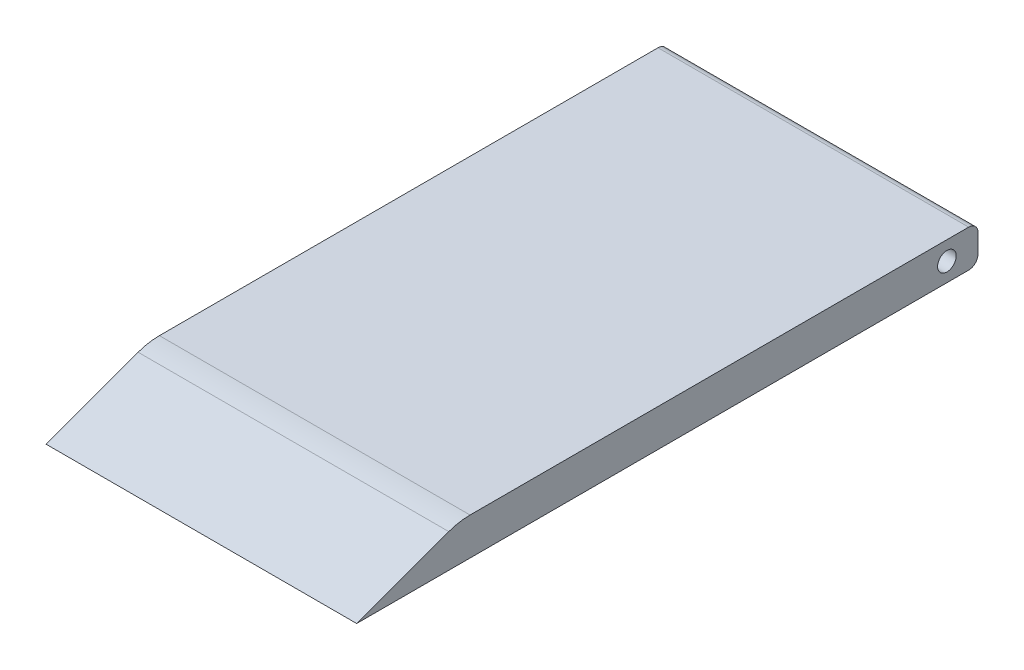
ISO-10303-21;
HEADER;
FILE_DESCRIPTION(('STEP AP214'),'2;1');
FILE_NAME('part.step','',(''),(''),'','','');
FILE_SCHEMA(('AUTOMOTIVE_DESIGN { 1 0 10303 214 1 1 1 1 }'));
ENDSEC;
DATA;
#1=APPLICATION_CONTEXT('core data for automotive mechanical design processes');
#2=APPLICATION_PROTOCOL_DEFINITION('international standard','automotive_design',2000,#1);
#3=PRODUCT_CONTEXT('',#1,'mechanical');
#4=PRODUCT('Part','Part','',(#3));
#5=PRODUCT_RELATED_PRODUCT_CATEGORY('part','',(#4));
#6=PRODUCT_DEFINITION_FORMATION('','',#4);
#7=PRODUCT_DEFINITION_CONTEXT('part definition',#1,'design');
#8=PRODUCT_DEFINITION('design','',#6,#7);
#9=PRODUCT_DEFINITION_SHAPE('','',#8);
#10=(LENGTH_UNIT() NAMED_UNIT(*) SI_UNIT(.MILLI.,.METRE.));
#11=(NAMED_UNIT(*) PLANE_ANGLE_UNIT() SI_UNIT($,.RADIAN.));
#12=(NAMED_UNIT(*) SI_UNIT($,.STERADIAN.) SOLID_ANGLE_UNIT());
#13=UNCERTAINTY_MEASURE_WITH_UNIT(LENGTH_MEASURE(1.E-05),#10,'distance_accuracy_value','');
#14=(GEOMETRIC_REPRESENTATION_CONTEXT(3) GLOBAL_UNCERTAINTY_ASSIGNED_CONTEXT((#13)) GLOBAL_UNIT_ASSIGNED_CONTEXT((#10,
#11,#12)) REPRESENTATION_CONTEXT('',''));
#15=CARTESIAN_POINT('',(0.,0.,0.));
#16=DIRECTION('',(0.,0.,1.));
#17=DIRECTION('',(1.,0.,0.));
#18=AXIS2_PLACEMENT_3D('',#15,#16,#17);
#19=CARTESIAN_POINT('',(0.,6.,0.));
#20=DIRECTION('',(1.,0.,0.));
#21=DIRECTION('',(0.,0.,-1.));
#22=AXIS2_PLACEMENT_3D('',#19,#20,#21);
#23=PLANE('',#22);
#24=CARTESIAN_POINT('',(0.,3.,5.));
#25=DIRECTION('',(1.,0.,0.));
#26=DIRECTION('',(0.,0.,-1.));
#27=AXIS2_PLACEMENT_3D('',#24,#25,#26);
#28=CIRCLE('',#27,1.5);
#29=CARTESIAN_POINT('',(0.,3.,3.5));
#30=VERTEX_POINT('',#29);
#31=EDGE_CURVE('E102',#30,#30,#28,.T.);
#32=ORIENTED_EDGE('',*,*,#31,.T.);
#33=EDGE_LOOP('',(#32));
#34=FACE_BOUND('',#33,.T.);
#35=DIRECTION('',(0.,0.34202014332567,-0.939692620785908));
#36=VECTOR('',#35,1.);
#37=CARTESIAN_POINT('',(0.,6.,83.5151354832723));
#38=LINE('',#37,#36);
#39=CARTESIAN_POINT('',(0.,0.,100.));
#40=VERTEX_POINT('',#39);
#41=CARTESIAN_POINT('',(0.,5.39692620785908,85.1720671094444));
#42=VERTEX_POINT('',#41);
#43=EDGE_CURVE('E95',#40,#42,#38,.T.);
#44=ORIENTED_EDGE('',*,*,#43,.T.);
#45=CARTESIAN_POINT('',(0.,-4.,81.7518656761877));
#46=DIRECTION('',(1.,0.,0.));
#47=DIRECTION('',(0.,0.,-1.));
#48=AXIS2_PLACEMENT_3D('',#45,#46,#47);
#49=CIRCLE('',#48,10.);
#50=CARTESIAN_POINT('',(0.,6.,81.7518656761877));
#51=VERTEX_POINT('',#50);
#52=EDGE_CURVE('E11',#42,#51,#49,.F.);
#53=ORIENTED_EDGE('',*,*,#52,.T.);
#54=DIRECTION('',(0.,0.,1.));
#55=VECTOR('',#54,1.);
#56=CARTESIAN_POINT('',(0.,6.,0.));
#57=LINE('',#56,#55);
#58=CARTESIAN_POINT('',(0.,6.,1.5));
#59=VERTEX_POINT('',#58);
#60=EDGE_CURVE('E143',#59,#51,#57,.T.);
#61=ORIENTED_EDGE('',*,*,#60,.F.);
#62=CARTESIAN_POINT('',(0.,4.5,1.5));
#63=DIRECTION('',(1.,0.,0.));
#64=DIRECTION('',(0.,0.,-1.));
#65=AXIS2_PLACEMENT_3D('',#62,#63,#64);
#66=CIRCLE('',#65,1.5);
#67=CARTESIAN_POINT('',(0.,4.5,0.));
#68=VERTEX_POINT('',#67);
#69=EDGE_CURVE('E130',#59,#68,#66,.F.);
#70=ORIENTED_EDGE('',*,*,#69,.T.);
#71=DIRECTION('',(0.,-1.,0.));
#72=VECTOR('',#71,1.);
#73=CARTESIAN_POINT('',(0.,6.,0.));
#74=LINE('',#73,#72);
#75=CARTESIAN_POINT('',(0.,1.5,0.));
#76=VERTEX_POINT('',#75);
#77=EDGE_CURVE('E140',#68,#76,#74,.T.);
#78=ORIENTED_EDGE('',*,*,#77,.T.);
#79=CARTESIAN_POINT('',(0.,1.5,1.5));
#80=DIRECTION('',(1.,0.,0.));
#81=DIRECTION('',(0.,0.,-1.));
#82=AXIS2_PLACEMENT_3D('',#79,#80,#81);
#83=CIRCLE('',#82,1.5);
#84=CARTESIAN_POINT('',(0.,0.,1.5));
#85=VERTEX_POINT('',#84);
#86=EDGE_CURVE('E98',#76,#85,#83,.F.);
#87=ORIENTED_EDGE('',*,*,#86,.T.);
#88=DIRECTION('',(0.,0.,1.));
#89=VECTOR('',#88,1.);
#90=CARTESIAN_POINT('',(0.,0.,0.));
#91=LINE('',#90,#89);
#92=EDGE_CURVE('E93',#85,#40,#91,.T.);
#93=ORIENTED_EDGE('',*,*,#92,.T.);
#94=EDGE_LOOP('',(#44,#53,#61,#70,#78,#87,#93));
#95=FACE_BOUND('',#94,.T.);
#96=ADVANCED_FACE('F36',(#34,#95),#23,.F.);
#97=CARTESIAN_POINT('',(50.,6.,100.));
#98=DIRECTION('',(-1.,0.,0.));
#99=DIRECTION('',(0.,0.,1.));
#100=AXIS2_PLACEMENT_3D('',#97,#98,#99);
#101=PLANE('',#100);
#102=CARTESIAN_POINT('',(50.,3.,5.));
#103=DIRECTION('',(1.,0.,0.));
#104=DIRECTION('',(0.,0.,-1.));
#105=AXIS2_PLACEMENT_3D('',#102,#103,#104);
#106=CIRCLE('',#105,1.5);
#107=CARTESIAN_POINT('',(50.,3.,3.5));
#108=VERTEX_POINT('',#107);
#109=EDGE_CURVE('E148',#108,#108,#106,.T.);
#110=ORIENTED_EDGE('',*,*,#109,.F.);
#111=EDGE_LOOP('',(#110));
#112=FACE_BOUND('',#111,.T.);
#113=DIRECTION('',(0.,0.,-1.));
#114=VECTOR('',#113,1.);
#115=CARTESIAN_POINT('',(50.,6.,100.));
#116=LINE('',#115,#114);
#117=CARTESIAN_POINT('',(50.,6.,81.7518656761877));
#118=VERTEX_POINT('',#117);
#119=CARTESIAN_POINT('',(50.,6.,1.5));
#120=VERTEX_POINT('',#119);
#121=EDGE_CURVE('E142',#118,#120,#116,.T.);
#122=ORIENTED_EDGE('',*,*,#121,.F.);
#123=CARTESIAN_POINT('',(50.,-4.,81.7518656761877));
#124=DIRECTION('',(-1.,0.,0.));
#125=DIRECTION('',(0.,0.,1.));
#126=AXIS2_PLACEMENT_3D('',#123,#124,#125);
#127=CIRCLE('',#126,10.);
#128=CARTESIAN_POINT('',(50.,5.39692620785908,85.1720671094444));
#129=VERTEX_POINT('',#128);
#130=EDGE_CURVE('E58',#118,#129,#127,.F.);
#131=ORIENTED_EDGE('',*,*,#130,.T.);
#132=DIRECTION('',(0.,-0.34202014332567,0.939692620785908));
#133=VECTOR('',#132,1.);
#134=CARTESIAN_POINT('',(50.,6.,83.5151354832723));
#135=LINE('',#134,#133);
#136=CARTESIAN_POINT('',(50.,0.,100.));
#137=VERTEX_POINT('',#136);
#138=EDGE_CURVE('E112',#129,#137,#135,.T.);
#139=ORIENTED_EDGE('',*,*,#138,.T.);
#140=DIRECTION('',(0.,0.,-1.));
#141=VECTOR('',#140,1.);
#142=CARTESIAN_POINT('',(50.,0.,100.));
#143=LINE('',#142,#141);
#144=CARTESIAN_POINT('',(50.,0.,1.5));
#145=VERTEX_POINT('',#144);
#146=EDGE_CURVE('E108',#137,#145,#143,.T.);
#147=ORIENTED_EDGE('',*,*,#146,.T.);
#148=CARTESIAN_POINT('',(50.,1.5,1.5));
#149=DIRECTION('',(-1.,0.,0.));
#150=DIRECTION('',(0.,0.,1.));
#151=AXIS2_PLACEMENT_3D('',#148,#149,#150);
#152=CIRCLE('',#151,1.5);
#153=CARTESIAN_POINT('',(50.,1.5,0.));
#154=VERTEX_POINT('',#153);
#155=EDGE_CURVE('E122',#145,#154,#152,.F.);
#156=ORIENTED_EDGE('',*,*,#155,.T.);
#157=DIRECTION('',(0.,-1.,0.));
#158=VECTOR('',#157,1.);
#159=CARTESIAN_POINT('',(50.,6.,0.));
#160=LINE('',#159,#158);
#161=CARTESIAN_POINT('',(50.,4.5,0.));
#162=VERTEX_POINT('',#161);
#163=EDGE_CURVE('E137',#162,#154,#160,.T.);
#164=ORIENTED_EDGE('',*,*,#163,.F.);
#165=CARTESIAN_POINT('',(50.,4.5,1.5));
#166=DIRECTION('',(-1.,0.,0.));
#167=DIRECTION('',(0.,0.,1.));
#168=AXIS2_PLACEMENT_3D('',#165,#166,#167);
#169=CIRCLE('',#168,1.5);
#170=EDGE_CURVE('E124',#162,#120,#169,.F.);
#171=ORIENTED_EDGE('',*,*,#170,.T.);
#172=EDGE_LOOP('',(#122,#131,#139,#147,#156,#164,#171));
#173=FACE_BOUND('',#172,.T.);
#174=ADVANCED_FACE('F162',(#112,#173),#101,.F.);
#175=CARTESIAN_POINT('',(0.,6.,0.));
#176=DIRECTION('',(0.,0.,1.));
#177=DIRECTION('',(1.,0.,0.));
#178=AXIS2_PLACEMENT_3D('',#175,#176,#177);
#179=PLANE('',#178);
#180=ORIENTED_EDGE('',*,*,#163,.T.);
#181=DIRECTION('',(-1.,0.,0.));
#182=VECTOR('',#181,1.);
#183=CARTESIAN_POINT('',(0.,1.5,0.));
#184=LINE('',#183,#182);
#185=EDGE_CURVE('E132',#154,#76,#184,.T.);
#186=ORIENTED_EDGE('',*,*,#185,.T.);
#187=ORIENTED_EDGE('',*,*,#77,.F.);
#188=DIRECTION('',(-1.,0.,0.));
#189=VECTOR('',#188,1.);
#190=CARTESIAN_POINT('',(50.,4.5,0.));
#191=LINE('',#190,#189);
#192=EDGE_CURVE('E135',#68,#162,#191,.F.);
#193=ORIENTED_EDGE('',*,*,#192,.T.);
#194=EDGE_LOOP('',(#180,#186,#187,#193));
#195=FACE_BOUND('',#194,.T.);
#196=ADVANCED_FACE('F164',(#195),#179,.F.);
#197=CARTESIAN_POINT('',(0.,6.,0.));
#198=DIRECTION('',(0.,1.,0.));
#199=DIRECTION('',(0.,0.,1.));
#200=AXIS2_PLACEMENT_3D('',#197,#198,#199);
#201=PLANE('',#200);
#202=ORIENTED_EDGE('',*,*,#60,.T.);
#203=DIRECTION('',(1.,0.,0.));
#204=VECTOR('',#203,1.);
#205=CARTESIAN_POINT('',(0.,6.,81.7518656761877));
#206=LINE('',#205,#204);
#207=EDGE_CURVE('E111',#51,#118,#206,.T.);
#208=ORIENTED_EDGE('',*,*,#207,.T.);
#209=ORIENTED_EDGE('',*,*,#121,.T.);
#210=DIRECTION('',(-1.,0.,0.));
#211=VECTOR('',#210,1.);
#212=CARTESIAN_POINT('',(0.,6.,1.5));
#213=LINE('',#212,#211);
#214=EDGE_CURVE('E116',#120,#59,#213,.T.);
#215=ORIENTED_EDGE('',*,*,#214,.T.);
#216=EDGE_LOOP('',(#202,#208,#209,#215));
#217=FACE_BOUND('',#216,.T.);
#218=ADVANCED_FACE('F170',(#217),#201,.T.);
#219=CARTESIAN_POINT('',(0.,0.,0.));
#220=DIRECTION('',(0.,1.,0.));
#221=DIRECTION('',(0.,0.,1.));
#222=AXIS2_PLACEMENT_3D('',#219,#220,#221);
#223=PLANE('',#222);
#224=ORIENTED_EDGE('',*,*,#92,.F.);
#225=DIRECTION('',(-1.,0.,0.));
#226=VECTOR('',#225,1.);
#227=CARTESIAN_POINT('',(0.,0.,1.5));
#228=LINE('',#227,#226);
#229=EDGE_CURVE('E127',#85,#145,#228,.F.);
#230=ORIENTED_EDGE('',*,*,#229,.T.);
#231=ORIENTED_EDGE('',*,*,#146,.F.);
#232=DIRECTION('',(1.,0.,0.));
#233=VECTOR('',#232,1.);
#234=CARTESIAN_POINT('',(0.,0.,100.));
#235=LINE('',#234,#233);
#236=EDGE_CURVE('E101',#40,#137,#235,.T.);
#237=ORIENTED_EDGE('',*,*,#236,.F.);
#238=EDGE_LOOP('',(#224,#230,#231,#237));
#239=FACE_BOUND('',#238,.T.);
#240=ADVANCED_FACE('F106',(#239),#223,.F.);
#241=CARTESIAN_POINT('',(0.,3.,5.));
#242=DIRECTION('',(1.,0.,0.));
#243=DIRECTION('',(0.,0.,-1.));
#244=AXIS2_PLACEMENT_3D('',#241,#242,#243);
#245=CYLINDRICAL_SURFACE('',#244,1.5);
#246=ORIENTED_EDGE('',*,*,#31,.F.);
#247=EDGE_LOOP('',(#246));
#248=FACE_BOUND('',#247,.T.);
#249=ORIENTED_EDGE('',*,*,#109,.T.);
#250=EDGE_LOOP('',(#249));
#251=FACE_BOUND('',#250,.T.);
#252=ADVANCED_FACE('F155',(#248,#251),#245,.F.);
#253=CARTESIAN_POINT('',(0.,1.5,1.5));
#254=DIRECTION('',(-1.,0.,0.));
#255=DIRECTION('',(0.,0.,1.));
#256=AXIS2_PLACEMENT_3D('',#253,#254,#255);
#257=CYLINDRICAL_SURFACE('',#256,1.5);
#258=ORIENTED_EDGE('',*,*,#155,.F.);
#259=ORIENTED_EDGE('',*,*,#229,.F.);
#260=ORIENTED_EDGE('',*,*,#86,.F.);
#261=ORIENTED_EDGE('',*,*,#185,.F.);
#262=EDGE_LOOP('',(#258,#259,#260,#261));
#263=FACE_BOUND('',#262,.T.);
#264=ADVANCED_FACE('F158',(#263),#257,.T.);
#265=CARTESIAN_POINT('',(0.,4.5,1.5));
#266=DIRECTION('',(1.,0.,0.));
#267=DIRECTION('',(0.,0.,-1.));
#268=AXIS2_PLACEMENT_3D('',#265,#266,#267);
#269=CYLINDRICAL_SURFACE('',#268,1.5);
#270=ORIENTED_EDGE('',*,*,#170,.F.);
#271=ORIENTED_EDGE('',*,*,#192,.F.);
#272=ORIENTED_EDGE('',*,*,#69,.F.);
#273=ORIENTED_EDGE('',*,*,#214,.F.);
#274=EDGE_LOOP('',(#270,#271,#272,#273));
#275=FACE_BOUND('',#274,.T.);
#276=ADVANCED_FACE('F179',(#275),#269,.T.);
#277=CARTESIAN_POINT('',(0.,6.,83.5151354832723));
#278=DIRECTION('',(0.,0.939692620785908,0.34202014332567));
#279=DIRECTION('',(-1.,0.,0.));
#280=AXIS2_PLACEMENT_3D('',#277,#278,#279);
#281=PLANE('',#280);
#282=ORIENTED_EDGE('',*,*,#138,.F.);
#283=DIRECTION('',(1.,0.,0.));
#284=VECTOR('',#283,1.);
#285=CARTESIAN_POINT('',(0.,5.39692620785908,85.1720671094444));
#286=LINE('',#285,#284);
#287=EDGE_CURVE('E44',#129,#42,#286,.F.);
#288=ORIENTED_EDGE('',*,*,#287,.T.);
#289=ORIENTED_EDGE('',*,*,#43,.F.);
#290=ORIENTED_EDGE('',*,*,#236,.T.);
#291=EDGE_LOOP('',(#282,#288,#289,#290));
#292=FACE_BOUND('',#291,.T.);
#293=ADVANCED_FACE('F110',(#292),#281,.T.);
#294=CARTESIAN_POINT('',(0.,-4.,81.7518656761877));
#295=DIRECTION('',(1.,0.,0.));
#296=DIRECTION('',(0.,0.,-1.));
#297=AXIS2_PLACEMENT_3D('',#294,#295,#296);
#298=CYLINDRICAL_SURFACE('',#297,10.);
#299=ORIENTED_EDGE('',*,*,#52,.F.);
#300=ORIENTED_EDGE('',*,*,#287,.F.);
#301=ORIENTED_EDGE('',*,*,#130,.F.);
#302=ORIENTED_EDGE('',*,*,#207,.F.);
#303=EDGE_LOOP('',(#299,#300,#301,#302));
#304=FACE_BOUND('',#303,.T.);
#305=ADVANCED_FACE('F38',(#304),#298,.T.);
#306=CLOSED_SHELL('',(#96,#174,#196,#218,#240,#252,#264,#276,#293,#305));
#307=MANIFOLD_SOLID_BREP('B2',#306);
#308=ADVANCED_BREP_SHAPE_REPRESENTATION('',(#18,#307),#14);
#309=SHAPE_DEFINITION_REPRESENTATION(#9,#308);
ENDSEC;
END-ISO-10303-21;
